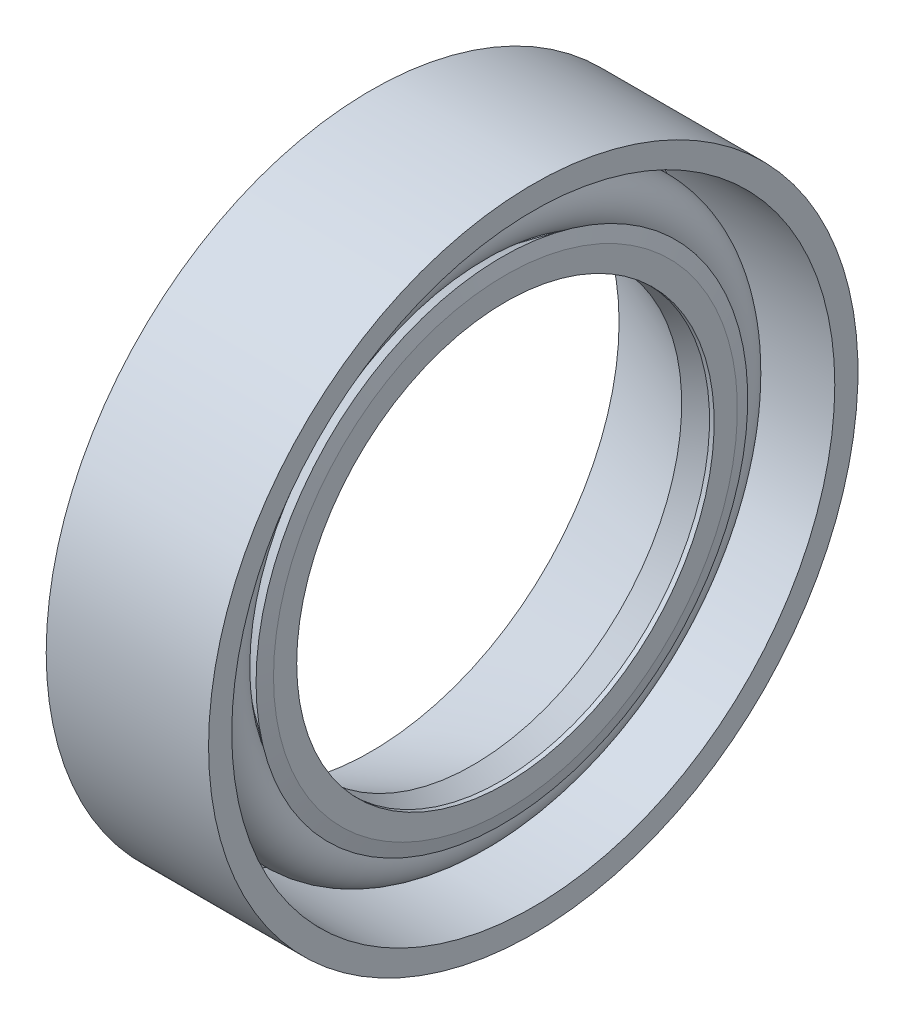
ISO-10303-21;
HEADER;
FILE_DESCRIPTION(('STEP AP214'),'2;1');
FILE_NAME('part.step','',(''),(''),'','','');
FILE_SCHEMA(('AUTOMOTIVE_DESIGN { 1 0 10303 214 1 1 1 1 }'));
ENDSEC;
DATA;
#1=APPLICATION_CONTEXT('core data for automotive mechanical design processes');
#2=APPLICATION_PROTOCOL_DEFINITION('international standard','automotive_design',2000,#1);
#3=PRODUCT_CONTEXT('',#1,'mechanical');
#4=PRODUCT('Part','Part','',(#3));
#5=PRODUCT_RELATED_PRODUCT_CATEGORY('part','',(#4));
#6=PRODUCT_DEFINITION_FORMATION('','',#4);
#7=PRODUCT_DEFINITION_CONTEXT('part definition',#1,'design');
#8=PRODUCT_DEFINITION('design','',#6,#7);
#9=PRODUCT_DEFINITION_SHAPE('','',#8);
#10=(LENGTH_UNIT() NAMED_UNIT(*) SI_UNIT(.MILLI.,.METRE.));
#11=(NAMED_UNIT(*) PLANE_ANGLE_UNIT() SI_UNIT($,.RADIAN.));
#12=(NAMED_UNIT(*) SI_UNIT($,.STERADIAN.) SOLID_ANGLE_UNIT());
#13=UNCERTAINTY_MEASURE_WITH_UNIT(LENGTH_MEASURE(1.E-05),#10,'distance_accuracy_value','');
#14=(GEOMETRIC_REPRESENTATION_CONTEXT(3) GLOBAL_UNCERTAINTY_ASSIGNED_CONTEXT((#13)) GLOBAL_UNIT_ASSIGNED_CONTEXT((#10,
#11,#12)) REPRESENTATION_CONTEXT('',''));
#15=CARTESIAN_POINT('',(0.,0.,0.));
#16=DIRECTION('',(0.,0.,1.));
#17=DIRECTION('',(1.,0.,0.));
#18=AXIS2_PLACEMENT_3D('',#15,#16,#17);
#19=CARTESIAN_POINT('',(0.,7.,0.));
#20=DIRECTION('',(1.,0.,0.));
#21=DIRECTION('',(0.,0.,-1.));
#22=AXIS2_PLACEMENT_3D('',#19,#20,#21);
#23=PLANE('',#22);
#24=CARTESIAN_POINT('',(0.,0.,0.));
#25=DIRECTION('',(-1.,0.,0.));
#26=DIRECTION('',(0.,0.,1.));
#27=AXIS2_PLACEMENT_3D('',#24,#25,#26);
#28=CIRCLE('',#27,5.35);
#29=CARTESIAN_POINT('',(0.,0.,5.35));
#30=VERTEX_POINT('',#29);
#31=EDGE_CURVE('E10',#30,#30,#28,.T.);
#32=ORIENTED_EDGE('',*,*,#31,.F.);
#33=EDGE_LOOP('',(#32));
#34=FACE_BOUND('',#33,.T.);
#35=CARTESIAN_POINT('',(0.,0.,0.));
#36=DIRECTION('',(-1.,0.,0.));
#37=DIRECTION('',(0.,0.,1.));
#38=AXIS2_PLACEMENT_3D('',#35,#36,#37);
#39=CIRCLE('',#38,7.);
#40=CARTESIAN_POINT('',(0.,0.,7.));
#41=VERTEX_POINT('',#40);
#42=EDGE_CURVE('E88',#41,#41,#39,.T.);
#43=ORIENTED_EDGE('',*,*,#42,.T.);
#44=EDGE_LOOP('',(#43));
#45=FACE_BOUND('',#44,.T.);
#46=ADVANCED_FACE('F39',(#34,#45),#23,.F.);
#47=CARTESIAN_POINT('',(0.,0.,0.));
#48=DIRECTION('',(-1.,0.,0.));
#49=DIRECTION('',(0.,0.,1.));
#50=AXIS2_PLACEMENT_3D('',#47,#48,#49);
#51=CONICAL_SURFACE('',#50,5.35,0.36869590265805);
#52=CARTESIAN_POINT('',(2.2,0.,0.));
#53=DIRECTION('',(-1.,0.,0.));
#54=DIRECTION('',(0.,0.,1.));
#55=AXIS2_PLACEMENT_3D('',#52,#53,#54);
#56=CIRCLE('',#55,4.5);
#57=CARTESIAN_POINT('',(2.2,0.,4.5));
#58=VERTEX_POINT('',#57);
#59=EDGE_CURVE('E45',#58,#58,#56,.T.);
#60=ORIENTED_EDGE('',*,*,#59,.F.);
#61=EDGE_LOOP('',(#60));
#62=FACE_BOUND('',#61,.T.);
#63=ORIENTED_EDGE('',*,*,#31,.T.);
#64=EDGE_LOOP('',(#63));
#65=FACE_BOUND('',#64,.T.);
#66=ADVANCED_FACE('F167',(#62,#65),#51,.F.);
#67=CARTESIAN_POINT('',(2.2,0.,0.));
#68=DIRECTION('',(1.,0.,0.));
#69=DIRECTION('',(0.,0.,-1.));
#70=AXIS2_PLACEMENT_3D('',#67,#68,#69);
#71=CONICAL_SURFACE('',#70,4.5,0.620249485982816);
#72=CARTESIAN_POINT('',(2.8,0.,0.));
#73=DIRECTION('',(-1.,0.,0.));
#74=DIRECTION('',(0.,0.,1.));
#75=AXIS2_PLACEMENT_3D('',#72,#73,#74);
#76=CIRCLE('',#75,4.92857142857143);
#77=CARTESIAN_POINT('',(2.8,0.,4.92857142857143));
#78=VERTEX_POINT('',#77);
#79=EDGE_CURVE('E49',#78,#78,#76,.T.);
#80=ORIENTED_EDGE('',*,*,#79,.F.);
#81=EDGE_LOOP('',(#80));
#82=FACE_BOUND('',#81,.T.);
#83=ORIENTED_EDGE('',*,*,#59,.T.);
#84=EDGE_LOOP('',(#83));
#85=FACE_BOUND('',#84,.T.);
#86=ADVANCED_FACE('F162',(#82,#85),#71,.F.);
#87=CARTESIAN_POINT('',(2.8,4.5,0.));
#88=DIRECTION('',(1.,0.,0.));
#89=DIRECTION('',(0.,0.,-1.));
#90=AXIS2_PLACEMENT_3D('',#87,#88,#89);
#91=PLANE('',#90);
#92=CARTESIAN_POINT('',(2.8,0.,0.));
#93=DIRECTION('',(-1.,0.,0.));
#94=DIRECTION('',(0.,0.,1.));
#95=AXIS2_PLACEMENT_3D('',#92,#93,#94);
#96=CIRCLE('',#95,4.5);
#97=CARTESIAN_POINT('',(2.8,0.,4.5));
#98=VERTEX_POINT('',#97);
#99=EDGE_CURVE('E53',#98,#98,#96,.T.);
#100=ORIENTED_EDGE('',*,*,#99,.F.);
#101=EDGE_LOOP('',(#100));
#102=FACE_BOUND('',#101,.T.);
#103=ORIENTED_EDGE('',*,*,#79,.T.);
#104=EDGE_LOOP('',(#103));
#105=FACE_BOUND('',#104,.T.);
#106=ADVANCED_FACE('F156',(#102,#105),#91,.F.);
#107=CARTESIAN_POINT('',(0.,0.,0.));
#108=DIRECTION('',(-1.,0.,0.));
#109=DIRECTION('',(0.,0.,1.));
#110=AXIS2_PLACEMENT_3D('',#107,#108,#109);
#111=CYLINDRICAL_SURFACE('',#110,4.5);
#112=CARTESIAN_POINT('',(2.9,0.,0.));
#113=DIRECTION('',(-1.,0.,0.));
#114=DIRECTION('',(0.,0.,1.));
#115=AXIS2_PLACEMENT_3D('',#112,#113,#114);
#116=CIRCLE('',#115,4.5);
#117=CARTESIAN_POINT('',(2.9,0.,4.5));
#118=VERTEX_POINT('',#117);
#119=EDGE_CURVE('E58',#118,#118,#116,.T.);
#120=ORIENTED_EDGE('',*,*,#119,.F.);
#121=EDGE_LOOP('',(#120));
#122=FACE_BOUND('',#121,.T.);
#123=ORIENTED_EDGE('',*,*,#99,.T.);
#124=EDGE_LOOP('',(#123));
#125=FACE_BOUND('',#124,.T.);
#126=ADVANCED_FACE('F150',(#122,#125),#111,.F.);
#127=CARTESIAN_POINT('',(2.9,5.,0.));
#128=DIRECTION('',(-1.,0.,0.));
#129=DIRECTION('',(0.,0.,1.));
#130=AXIS2_PLACEMENT_3D('',#127,#128,#129);
#131=PLANE('',#130);
#132=CARTESIAN_POINT('',(2.9,0.,0.));
#133=DIRECTION('',(-1.,0.,0.));
#134=DIRECTION('',(0.,0.,1.));
#135=AXIS2_PLACEMENT_3D('',#132,#133,#134);
#136=CIRCLE('',#135,5.);
#137=CARTESIAN_POINT('',(2.9,0.,5.));
#138=VERTEX_POINT('',#137);
#139=EDGE_CURVE('E61',#138,#138,#136,.T.);
#140=ORIENTED_EDGE('',*,*,#139,.F.);
#141=EDGE_LOOP('',(#140));
#142=FACE_BOUND('',#141,.T.);
#143=ORIENTED_EDGE('',*,*,#119,.T.);
#144=EDGE_LOOP('',(#143));
#145=FACE_BOUND('',#144,.T.);
#146=ADVANCED_FACE('F144',(#142,#145),#131,.F.);
#147=CARTESIAN_POINT('',(2.9,0.,0.));
#148=DIRECTION('',(-1.,0.,0.));
#149=DIRECTION('',(0.,0.,1.));
#150=AXIS2_PLACEMENT_3D('',#147,#148,#149);
#151=CONICAL_SURFACE('',#150,5.,1.32157312204655);
#152=CARTESIAN_POINT('',(2.82364560703017,0.,0.));
#153=DIRECTION('',(-1.,0.,0.));
#154=DIRECTION('',(0.,0.,1.));
#155=AXIS2_PLACEMENT_3D('',#152,#153,#154);
#156=CIRCLE('',#155,5.3);
#157=CARTESIAN_POINT('',(2.82364560703017,0.,5.3));
#158=VERTEX_POINT('',#157);
#159=EDGE_CURVE('E64',#158,#158,#156,.T.);
#160=ORIENTED_EDGE('',*,*,#159,.F.);
#161=EDGE_LOOP('',(#160));
#162=FACE_BOUND('',#161,.T.);
#163=ORIENTED_EDGE('',*,*,#139,.T.);
#164=EDGE_LOOP('',(#163));
#165=FACE_BOUND('',#164,.T.);
#166=ADVANCED_FACE('F138',(#162,#165),#151,.T.);
#167=CARTESIAN_POINT('',(2.82364560703017,0.,0.));
#168=DIRECTION('',(1.,0.,0.));
#169=DIRECTION('',(0.,0.,-1.));
#170=AXIS2_PLACEMENT_3D('',#167,#168,#169);
#171=CONICAL_SURFACE('',#170,5.3,0.620249485982813);
#172=CARTESIAN_POINT('',(2.17265883006478,0.,0.));
#173=DIRECTION('',(-1.,0.,0.));
#174=DIRECTION('',(0.,0.,1.));
#175=AXIS2_PLACEMENT_3D('',#172,#173,#174);
#176=CIRCLE('',#175,4.83500944502472);
#177=CARTESIAN_POINT('',(2.17265883006478,0.,4.83500944502472));
#178=VERTEX_POINT('',#177);
#179=EDGE_CURVE('E67',#178,#178,#176,.T.);
#180=ORIENTED_EDGE('',*,*,#179,.F.);
#181=EDGE_LOOP('',(#180));
#182=FACE_BOUND('',#181,.T.);
#183=ORIENTED_EDGE('',*,*,#159,.T.);
#184=EDGE_LOOP('',(#183));
#185=FACE_BOUND('',#184,.T.);
#186=ADVANCED_FACE('F132',(#182,#185),#171,.T.);
#187=CARTESIAN_POINT('',(2.17265883006478,0.,0.));
#188=DIRECTION('',(-1.,0.,0.));
#189=DIRECTION('',(0.,0.,1.));
#190=AXIS2_PLACEMENT_3D('',#187,#188,#189);
#191=CONICAL_SURFACE('',#190,4.83500944502472,0.378405450981254);
#192=CARTESIAN_POINT('',(1.97723357800418,0.,0.));
#193=DIRECTION('',(-1.,0.,0.));
#194=DIRECTION('',(0.,0.,1.));
#195=AXIS2_PLACEMENT_3D('',#192,#193,#194);
#196=CIRCLE('',#195,4.91270367919137);
#197=CARTESIAN_POINT('',(1.97723357800418,0.,4.91270367919137));
#198=VERTEX_POINT('',#197);
#199=EDGE_CURVE('E70',#198,#198,#196,.T.);
#200=ORIENTED_EDGE('',*,*,#199,.F.);
#201=EDGE_LOOP('',(#200));
#202=FACE_BOUND('',#201,.T.);
#203=ORIENTED_EDGE('',*,*,#179,.T.);
#204=EDGE_LOOP('',(#203));
#205=FACE_BOUND('',#204,.T.);
#206=ADVANCED_FACE('F126',(#202,#205),#191,.T.);
#207=CARTESIAN_POINT('',(2.04875346504969,0.,0.));
#208=DIRECTION('',(-1.,0.,0.));
#209=DIRECTION('',(0.,0.,1.));
#210=AXIS2_PLACEMENT_3D('',#207,#208,#209);
#211=TOROIDAL_SURFACE('',#210,5.50842585080915,0.6);
#212=CARTESIAN_POINT('',(1.69172388333335,0.,0.));
#213=DIRECTION('',(-1.,0.,0.));
#214=DIRECTION('',(0.,0.,1.));
#215=AXIS2_PLACEMENT_3D('',#212,#213,#214);
#216=CIRCLE('',#215,5.02621233194073);
#217=CARTESIAN_POINT('',(1.69172388333335,0.,5.02621233194073));
#218=VERTEX_POINT('',#217);
#219=EDGE_CURVE('E73',#218,#218,#216,.T.);
#220=ORIENTED_EDGE('',*,*,#219,.F.);
#221=EDGE_LOOP('',(#220));
#222=FACE_BOUND('',#221,.T.);
#223=ORIENTED_EDGE('',*,*,#199,.T.);
#224=EDGE_LOOP('',(#223));
#225=FACE_BOUND('',#224,.T.);
#226=ADVANCED_FACE('F120',(#222,#225),#211,.T.);
#227=CARTESIAN_POINT('',(1.69172388333335,0.,0.));
#228=DIRECTION('',(-1.,0.,0.));
#229=DIRECTION('',(0.,0.,1.));
#230=AXIS2_PLACEMENT_3D('',#227,#228,#229);
#231=CONICAL_SURFACE('',#230,5.02621233194073,0.378405450981252);
#232=CARTESIAN_POINT('',(0.5,0.,0.));
#233=DIRECTION('',(-1.,0.,0.));
#234=DIRECTION('',(0.,0.,1.));
#235=AXIS2_PLACEMENT_3D('',#232,#233,#234);
#236=CIRCLE('',#235,5.5);
#237=CARTESIAN_POINT('',(0.5,0.,5.5));
#238=VERTEX_POINT('',#237);
#239=EDGE_CURVE('E76',#238,#238,#236,.T.);
#240=ORIENTED_EDGE('',*,*,#239,.F.);
#241=EDGE_LOOP('',(#240));
#242=FACE_BOUND('',#241,.T.);
#243=ORIENTED_EDGE('',*,*,#219,.T.);
#244=EDGE_LOOP('',(#243));
#245=FACE_BOUND('',#244,.T.);
#246=ADVANCED_FACE('F114',(#242,#245),#231,.T.);
#247=CARTESIAN_POINT('',(0.5,6.5,0.));
#248=DIRECTION('',(-1.,0.,0.));
#249=DIRECTION('',(0.,0.,1.));
#250=AXIS2_PLACEMENT_3D('',#247,#248,#249);
#251=PLANE('',#250);
#252=CARTESIAN_POINT('',(0.5,0.,0.));
#253=DIRECTION('',(-1.,0.,0.));
#254=DIRECTION('',(0.,0.,1.));
#255=AXIS2_PLACEMENT_3D('',#252,#253,#254);
#256=CIRCLE('',#255,6.5);
#257=CARTESIAN_POINT('',(0.5,0.,6.5));
#258=VERTEX_POINT('',#257);
#259=EDGE_CURVE('E79',#258,#258,#256,.T.);
#260=ORIENTED_EDGE('',*,*,#259,.F.);
#261=EDGE_LOOP('',(#260));
#262=FACE_BOUND('',#261,.T.);
#263=ORIENTED_EDGE('',*,*,#239,.T.);
#264=EDGE_LOOP('',(#263));
#265=FACE_BOUND('',#264,.T.);
#266=ADVANCED_FACE('F108',(#262,#265),#251,.F.);
#267=CARTESIAN_POINT('',(0.,0.,0.));
#268=DIRECTION('',(-1.,0.,0.));
#269=DIRECTION('',(0.,0.,1.));
#270=AXIS2_PLACEMENT_3D('',#267,#268,#269);
#271=CYLINDRICAL_SURFACE('',#270,6.5);
#272=CARTESIAN_POINT('',(3.5,0.,0.));
#273=DIRECTION('',(-1.,0.,0.));
#274=DIRECTION('',(0.,0.,1.));
#275=AXIS2_PLACEMENT_3D('',#272,#273,#274);
#276=CIRCLE('',#275,6.5);
#277=CARTESIAN_POINT('',(3.5,0.,6.5));
#278=VERTEX_POINT('',#277);
#279=EDGE_CURVE('E82',#278,#278,#276,.T.);
#280=ORIENTED_EDGE('',*,*,#279,.F.);
#281=EDGE_LOOP('',(#280));
#282=FACE_BOUND('',#281,.T.);
#283=ORIENTED_EDGE('',*,*,#259,.T.);
#284=EDGE_LOOP('',(#283));
#285=FACE_BOUND('',#284,.T.);
#286=ADVANCED_FACE('F102',(#282,#285),#271,.F.);
#287=CARTESIAN_POINT('',(3.5,7.,0.));
#288=DIRECTION('',(-1.,0.,0.));
#289=DIRECTION('',(0.,0.,1.));
#290=AXIS2_PLACEMENT_3D('',#287,#288,#289);
#291=PLANE('',#290);
#292=CARTESIAN_POINT('',(3.5,0.,0.));
#293=DIRECTION('',(-1.,0.,0.));
#294=DIRECTION('',(0.,0.,1.));
#295=AXIS2_PLACEMENT_3D('',#292,#293,#294);
#296=CIRCLE('',#295,7.);
#297=CARTESIAN_POINT('',(3.5,0.,7.));
#298=VERTEX_POINT('',#297);
#299=EDGE_CURVE('E85',#298,#298,#296,.T.);
#300=ORIENTED_EDGE('',*,*,#299,.F.);
#301=EDGE_LOOP('',(#300));
#302=FACE_BOUND('',#301,.T.);
#303=ORIENTED_EDGE('',*,*,#279,.T.);
#304=EDGE_LOOP('',(#303));
#305=FACE_BOUND('',#304,.T.);
#306=ADVANCED_FACE('F96',(#302,#305),#291,.F.);
#307=CARTESIAN_POINT('',(0.,0.,0.));
#308=DIRECTION('',(-1.,0.,0.));
#309=DIRECTION('',(0.,0.,1.));
#310=AXIS2_PLACEMENT_3D('',#307,#308,#309);
#311=CYLINDRICAL_SURFACE('',#310,7.);
#312=ORIENTED_EDGE('',*,*,#42,.F.);
#313=EDGE_LOOP('',(#312));
#314=FACE_BOUND('',#313,.T.);
#315=ORIENTED_EDGE('',*,*,#299,.T.);
#316=EDGE_LOOP('',(#315));
#317=FACE_BOUND('',#316,.T.);
#318=ADVANCED_FACE('F93',(#314,#317),#311,.T.);
#319=CLOSED_SHELL('',(#46,#66,#86,#106,#126,#146,#166,#186,#206,#226,#246,#266,#286,#306,#318));
#320=MANIFOLD_SOLID_BREP('B2',#319);
#321=ADVANCED_BREP_SHAPE_REPRESENTATION('',(#18,#320),#14);
#322=SHAPE_DEFINITION_REPRESENTATION(#9,#321);
ENDSEC;
END-ISO-10303-21;
